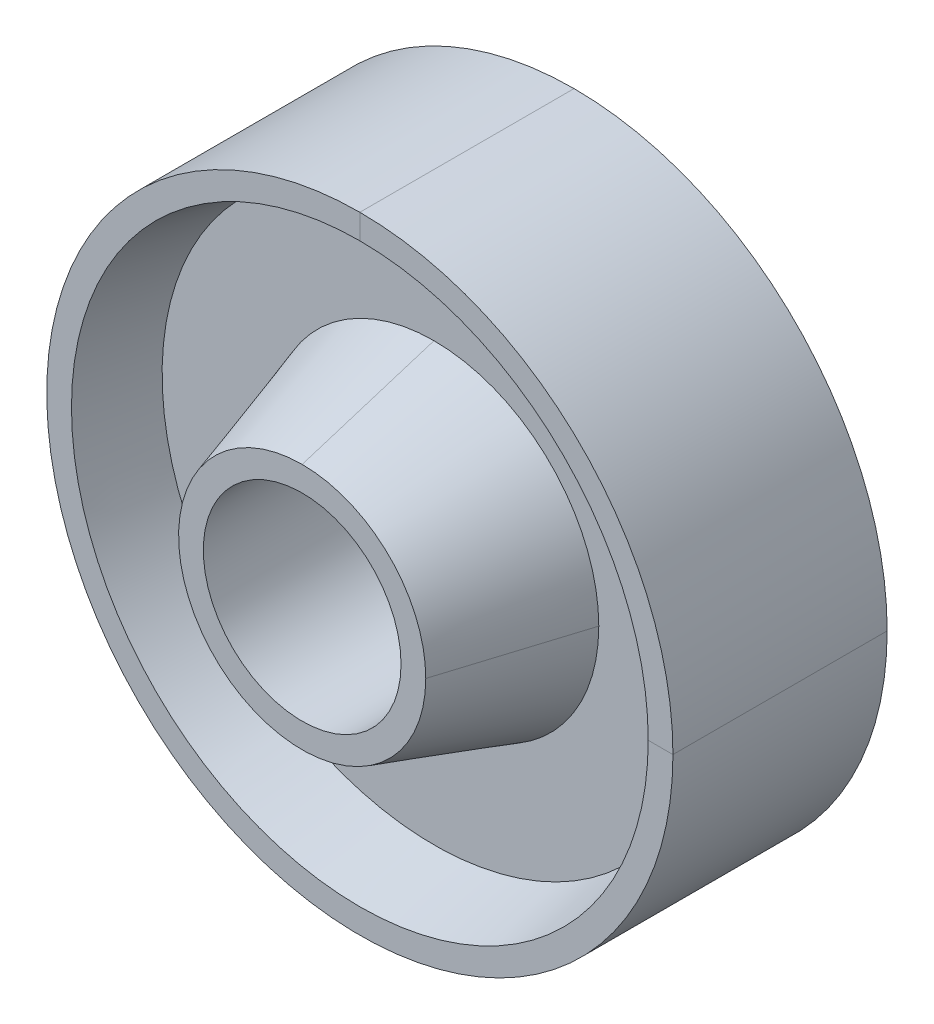
ISO-10303-21;
HEADER;
FILE_DESCRIPTION(('STEP AP214'),'2;1');
FILE_NAME('part.step','',(''),(''),'','','');
FILE_SCHEMA(('AUTOMOTIVE_DESIGN { 1 0 10303 214 1 1 1 1 }'));
ENDSEC;
DATA;
#1=APPLICATION_CONTEXT('core data for automotive mechanical design processes');
#2=APPLICATION_PROTOCOL_DEFINITION('international standard','automotive_design',2000,#1);
#3=PRODUCT_CONTEXT('',#1,'mechanical');
#4=PRODUCT('Part','Part','',(#3));
#5=PRODUCT_RELATED_PRODUCT_CATEGORY('part','',(#4));
#6=PRODUCT_DEFINITION_FORMATION('','',#4);
#7=PRODUCT_DEFINITION_CONTEXT('part definition',#1,'design');
#8=PRODUCT_DEFINITION('design','',#6,#7);
#9=PRODUCT_DEFINITION_SHAPE('','',#8);
#10=(LENGTH_UNIT() NAMED_UNIT(*) SI_UNIT(.MILLI.,.METRE.));
#11=(NAMED_UNIT(*) PLANE_ANGLE_UNIT() SI_UNIT($,.RADIAN.));
#12=(NAMED_UNIT(*) SI_UNIT($,.STERADIAN.) SOLID_ANGLE_UNIT());
#13=UNCERTAINTY_MEASURE_WITH_UNIT(LENGTH_MEASURE(1.E-05),#10,'distance_accuracy_value','');
#14=(GEOMETRIC_REPRESENTATION_CONTEXT(3) GLOBAL_UNCERTAINTY_ASSIGNED_CONTEXT((#13)) GLOBAL_UNIT_ASSIGNED_CONTEXT((#10,
#11,#12)) REPRESENTATION_CONTEXT('',''));
#15=CARTESIAN_POINT('',(0.,0.,0.));
#16=DIRECTION('',(0.,0.,1.));
#17=DIRECTION('',(1.,0.,0.));
#18=AXIS2_PLACEMENT_3D('',#15,#16,#17);
#19=CARTESIAN_POINT('',(0.,0.,20.));
#20=DIRECTION('',(0.,0.,1.));
#21=DIRECTION('',(1.,0.,0.));
#22=AXIS2_PLACEMENT_3D('',#19,#20,#21);
#23=PLANE('',#22);
#24=CARTESIAN_POINT('',(0.,0.,20.));
#25=DIRECTION('',(0.,0.,1.));
#26=DIRECTION('',(1.,0.,0.));
#27=AXIS2_PLACEMENT_3D('',#24,#25,#26);
#28=CIRCLE('',#27,15.);
#29=CARTESIAN_POINT('',(15.,0.,20.));
#30=VERTEX_POINT('',#29);
#31=CARTESIAN_POINT('',(0.,15.,20.));
#32=VERTEX_POINT('',#31);
#33=EDGE_CURVE('E11',#30,#32,#28,.T.);
#34=ORIENTED_EDGE('',*,*,#33,.T.);
#35=CARTESIAN_POINT('',(0.,0.,20.));
#36=DIRECTION('',(0.,0.,-1.));
#37=DIRECTION('',(1.,0.,0.));
#38=AXIS2_PLACEMENT_3D('',#35,#36,#37);
#39=CIRCLE('',#38,15.);
#40=EDGE_CURVE('E191',#30,#32,#39,.T.);
#41=ORIENTED_EDGE('',*,*,#40,.F.);
#42=EDGE_LOOP('',(#34,#41));
#43=FACE_BOUND('',#42,.T.);
#44=CARTESIAN_POINT('',(0.,0.,20.));
#45=DIRECTION('',(0.,0.,1.));
#46=DIRECTION('',(1.,0.,0.));
#47=AXIS2_PLACEMENT_3D('',#44,#45,#46);
#48=CIRCLE('',#47,12.);
#49=CARTESIAN_POINT('',(12.,0.,20.));
#50=VERTEX_POINT('',#49);
#51=EDGE_CURVE('E206',#50,#50,#48,.T.);
#52=ORIENTED_EDGE('',*,*,#51,.F.);
#53=EDGE_LOOP('',(#52));
#54=FACE_BOUND('',#53,.T.);
#55=ADVANCED_FACE('F45',(#43,#54),#23,.T.);
#56=CARTESIAN_POINT('',(0.,0.,-20.));
#57=DIRECTION('',(0.,0.,1.));
#58=DIRECTION('',(1.,0.,0.));
#59=AXIS2_PLACEMENT_3D('',#56,#57,#58);
#60=PLANE('',#59);
#61=CARTESIAN_POINT('',(0.,0.,-20.));
#62=DIRECTION('',(0.,0.,1.));
#63=DIRECTION('',(1.,0.,0.));
#64=AXIS2_PLACEMENT_3D('',#61,#62,#63);
#65=CIRCLE('',#64,15.);
#66=CARTESIAN_POINT('',(15.,0.,-20.));
#67=VERTEX_POINT('',#66);
#68=CARTESIAN_POINT('',(0.,15.,-20.));
#69=VERTEX_POINT('',#68);
#70=EDGE_CURVE('E55',#67,#69,#65,.T.);
#71=ORIENTED_EDGE('',*,*,#70,.F.);
#72=CARTESIAN_POINT('',(0.,0.,-20.));
#73=DIRECTION('',(0.,0.,-1.));
#74=DIRECTION('',(1.,0.,0.));
#75=AXIS2_PLACEMENT_3D('',#72,#73,#74);
#76=CIRCLE('',#75,15.);
#77=EDGE_CURVE('E195',#67,#69,#76,.T.);
#78=ORIENTED_EDGE('',*,*,#77,.T.);
#79=EDGE_LOOP('',(#71,#78));
#80=FACE_BOUND('',#79,.T.);
#81=CARTESIAN_POINT('',(0.,0.,-20.));
#82=DIRECTION('',(0.,0.,1.));
#83=DIRECTION('',(1.,0.,0.));
#84=AXIS2_PLACEMENT_3D('',#81,#82,#83);
#85=CIRCLE('',#84,12.);
#86=CARTESIAN_POINT('',(12.,0.,-20.));
#87=VERTEX_POINT('',#86);
#88=EDGE_CURVE('E205',#87,#87,#85,.T.);
#89=ORIENTED_EDGE('',*,*,#88,.T.);
#90=EDGE_LOOP('',(#89));
#91=FACE_BOUND('',#90,.T.);
#92=ADVANCED_FACE('F47',(#80,#91),#60,.F.);
#93=CARTESIAN_POINT('',(0.,0.,20.));
#94=DIRECTION('',(0.,0.,-1.));
#95=DIRECTION('',(-1.,0.,0.));
#96=AXIS2_PLACEMENT_3D('',#93,#94,#95);
#97=CYLINDRICAL_SURFACE('',#96,12.);
#98=ORIENTED_EDGE('',*,*,#51,.T.);
#99=EDGE_LOOP('',(#98));
#100=FACE_BOUND('',#99,.T.);
#101=ORIENTED_EDGE('',*,*,#88,.F.);
#102=EDGE_LOOP('',(#101));
#103=FACE_BOUND('',#102,.T.);
#104=ADVANCED_FACE('F310',(#100,#103),#97,.F.);
#105=CARTESIAN_POINT('',(0.,0.,-20.));
#106=DIRECTION('',(0.,0.,1.));
#107=DIRECTION('',(1.,0.,0.));
#108=AXIS2_PLACEMENT_3D('',#105,#106,#107);
#109=CONICAL_SURFACE('',#108,15.,0.302884868374971);
#110=DIRECTION('',(0.,0.298274993135947,0.95447997803503));
#111=VECTOR('',#110,1.);
#112=CARTESIAN_POINT('',(0.,20.,-4.));
#113=LINE('',#112,#111);
#114=CARTESIAN_POINT('',(0.,20.,-4.));
#115=VERTEX_POINT('',#114);
#116=EDGE_CURVE('E181',#69,#115,#113,.T.);
#117=ORIENTED_EDGE('',*,*,#116,.F.);
#118=ORIENTED_EDGE('',*,*,#77,.F.);
#119=DIRECTION('',(0.298274993135947,0.,0.95447997803503));
#120=VECTOR('',#119,1.);
#121=CARTESIAN_POINT('',(20.,0.,-4.));
#122=LINE('',#121,#120);
#123=CARTESIAN_POINT('',(20.,0.,-4.));
#124=VERTEX_POINT('',#123);
#125=EDGE_CURVE('E186',#67,#124,#122,.T.);
#126=ORIENTED_EDGE('',*,*,#125,.T.);
#127=CARTESIAN_POINT('',(0.,0.,-4.));
#128=DIRECTION('',(0.,0.,-1.));
#129=DIRECTION('',(1.,0.,0.));
#130=AXIS2_PLACEMENT_3D('',#127,#128,#129);
#131=CIRCLE('',#130,20.);
#132=EDGE_CURVE('E202',#124,#115,#131,.T.);
#133=ORIENTED_EDGE('',*,*,#132,.T.);
#134=EDGE_LOOP('',(#117,#118,#126,#133));
#135=FACE_BOUND('',#134,.T.);
#136=ADVANCED_FACE('F315',(#135),#109,.T.);
#137=CARTESIAN_POINT('',(0.,0.,-20.));
#138=DIRECTION('',(0.,0.,1.));
#139=DIRECTION('',(1.,0.,0.));
#140=AXIS2_PLACEMENT_3D('',#137,#138,#139);
#141=CONICAL_SURFACE('',#140,15.,0.302884868374971);
#142=CARTESIAN_POINT('',(0.,0.,-4.));
#143=DIRECTION('',(0.,0.,-1.));
#144=DIRECTION('',(0.,1.,0.));
#145=AXIS2_PLACEMENT_3D('',#142,#143,#144);
#146=CIRCLE('',#145,20.);
#147=EDGE_CURVE('E199',#115,#124,#146,.T.);
#148=ORIENTED_EDGE('',*,*,#147,.T.);
#149=ORIENTED_EDGE('',*,*,#125,.F.);
#150=ORIENTED_EDGE('',*,*,#70,.T.);
#151=ORIENTED_EDGE('',*,*,#116,.T.);
#152=EDGE_LOOP('',(#148,#149,#150,#151));
#153=FACE_BOUND('',#152,.T.);
#154=ADVANCED_FACE('F319',(#153),#141,.T.);
#155=CARTESIAN_POINT('',(0.,0.,4.));
#156=DIRECTION('',(0.,0.,-1.));
#157=DIRECTION('',(-1.,0.,0.));
#158=AXIS2_PLACEMENT_3D('',#155,#156,#157);
#159=CONICAL_SURFACE('',#158,20.,0.302884868374972);
#160=ORIENTED_EDGE('',*,*,#33,.F.);
#161=DIRECTION('',(-0.298274993135947,0.,0.95447997803503));
#162=VECTOR('',#161,1.);
#163=CARTESIAN_POINT('',(20.,0.,4.));
#164=LINE('',#163,#162);
#165=CARTESIAN_POINT('',(20.,0.,4.));
#166=VERTEX_POINT('',#165);
#167=EDGE_CURVE('E182',#166,#30,#164,.T.);
#168=ORIENTED_EDGE('',*,*,#167,.F.);
#169=CARTESIAN_POINT('',(0.,0.,4.));
#170=DIRECTION('',(0.,0.,-1.));
#171=DIRECTION('',(0.,1.,0.));
#172=AXIS2_PLACEMENT_3D('',#169,#170,#171);
#173=CIRCLE('',#172,20.);
#174=CARTESIAN_POINT('',(0.,20.,4.));
#175=VERTEX_POINT('',#174);
#176=EDGE_CURVE('E187',#175,#166,#173,.T.);
#177=ORIENTED_EDGE('',*,*,#176,.F.);
#178=DIRECTION('',(0.,-0.298274993135947,0.95447997803503));
#179=VECTOR('',#178,1.);
#180=CARTESIAN_POINT('',(0.,20.,4.));
#181=LINE('',#180,#179);
#182=EDGE_CURVE('E177',#175,#32,#181,.T.);
#183=ORIENTED_EDGE('',*,*,#182,.T.);
#184=EDGE_LOOP('',(#160,#168,#177,#183));
#185=FACE_BOUND('',#184,.T.);
#186=ADVANCED_FACE('F298',(#185),#159,.T.);
#187=CARTESIAN_POINT('',(0.,0.,4.));
#188=DIRECTION('',(0.,0.,-1.));
#189=DIRECTION('',(-1.,0.,0.));
#190=AXIS2_PLACEMENT_3D('',#187,#188,#189);
#191=CONICAL_SURFACE('',#190,20.,0.302884868374972);
#192=ORIENTED_EDGE('',*,*,#182,.F.);
#193=CARTESIAN_POINT('',(0.,0.,4.));
#194=DIRECTION('',(0.,0.,-1.));
#195=DIRECTION('',(1.,0.,0.));
#196=AXIS2_PLACEMENT_3D('',#193,#194,#195);
#197=CIRCLE('',#196,20.);
#198=EDGE_CURVE('E196',#166,#175,#197,.T.);
#199=ORIENTED_EDGE('',*,*,#198,.F.);
#200=ORIENTED_EDGE('',*,*,#167,.T.);
#201=ORIENTED_EDGE('',*,*,#40,.T.);
#202=EDGE_LOOP('',(#192,#199,#200,#201));
#203=FACE_BOUND('',#202,.T.);
#204=ADVANCED_FACE('F289',(#203),#191,.T.);
#205=CARTESIAN_POINT('',(20.,0.,4.));
#206=DIRECTION('',(0.,0.,1.));
#207=DIRECTION('',(1.,0.,0.));
#208=AXIS2_PLACEMENT_3D('',#205,#206,#207);
#209=PLANE('',#208);
#210=ORIENTED_EDGE('',*,*,#176,.T.);
#211=ORIENTED_EDGE('',*,*,#198,.T.);
#212=EDGE_LOOP('',(#210,#211));
#213=FACE_BOUND('',#212,.T.);
#214=CARTESIAN_POINT('',(0.,0.,4.));
#215=DIRECTION('',(0.,0.,-1.));
#216=DIRECTION('',(1.,0.,0.));
#217=AXIS2_PLACEMENT_3D('',#214,#215,#216);
#218=CIRCLE('',#217,33.);
#219=CARTESIAN_POINT('',(33.,0.,4.));
#220=VERTEX_POINT('',#219);
#221=CARTESIAN_POINT('',(0.,33.,4.));
#222=VERTEX_POINT('',#221);
#223=EDGE_CURVE('E174',#220,#222,#218,.T.);
#224=ORIENTED_EDGE('',*,*,#223,.F.);
#225=CARTESIAN_POINT('',(0.,0.,4.));
#226=DIRECTION('',(0.,0.,1.));
#227=DIRECTION('',(1.,0.,0.));
#228=AXIS2_PLACEMENT_3D('',#225,#226,#227);
#229=CIRCLE('',#228,33.);
#230=EDGE_CURVE('E62',#220,#222,#229,.T.);
#231=ORIENTED_EDGE('',*,*,#230,.T.);
#232=EDGE_LOOP('',(#224,#231));
#233=FACE_BOUND('',#232,.T.);
#234=ADVANCED_FACE('F286',(#213,#233),#209,.T.);
#235=CARTESIAN_POINT('',(20.,0.,-4.));
#236=DIRECTION('',(0.,0.,-1.));
#237=DIRECTION('',(-1.,0.,0.));
#238=AXIS2_PLACEMENT_3D('',#235,#236,#237);
#239=PLANE('',#238);
#240=CARTESIAN_POINT('',(0.,0.,-4.));
#241=DIRECTION('',(0.,0.,-1.));
#242=DIRECTION('',(1.,0.,0.));
#243=AXIS2_PLACEMENT_3D('',#240,#241,#242);
#244=CIRCLE('',#243,33.);
#245=CARTESIAN_POINT('',(33.,0.,-4.));
#246=VERTEX_POINT('',#245);
#247=CARTESIAN_POINT('',(0.,33.,-4.));
#248=VERTEX_POINT('',#247);
#249=EDGE_CURVE('E178',#246,#248,#244,.T.);
#250=ORIENTED_EDGE('',*,*,#249,.T.);
#251=CARTESIAN_POINT('',(0.,0.,-4.));
#252=DIRECTION('',(0.,0.,1.));
#253=DIRECTION('',(1.,0.,0.));
#254=AXIS2_PLACEMENT_3D('',#251,#252,#253);
#255=CIRCLE('',#254,33.);
#256=EDGE_CURVE('E70',#246,#248,#255,.T.);
#257=ORIENTED_EDGE('',*,*,#256,.F.);
#258=EDGE_LOOP('',(#250,#257));
#259=FACE_BOUND('',#258,.T.);
#260=ORIENTED_EDGE('',*,*,#132,.F.);
#261=ORIENTED_EDGE('',*,*,#147,.F.);
#262=EDGE_LOOP('',(#260,#261));
#263=FACE_BOUND('',#262,.T.);
#264=ADVANCED_FACE('F288',(#259,#263),#239,.T.);
#265=CARTESIAN_POINT('',(0.,0.,-4.));
#266=DIRECTION('',(0.,0.,1.));
#267=DIRECTION('',(1.,0.,0.));
#268=AXIS2_PLACEMENT_3D('',#265,#266,#267);
#269=CYLINDRICAL_SURFACE('',#268,38.);
#270=DIRECTION('',(0.,0.,1.));
#271=VECTOR('',#270,1.);
#272=CARTESIAN_POINT('',(38.,0.,13.));
#273=LINE('',#272,#271);
#274=CARTESIAN_POINT('',(38.,0.,-13.));
#275=VERTEX_POINT('',#274);
#276=CARTESIAN_POINT('',(38.,0.,13.));
#277=VERTEX_POINT('',#276);
#278=EDGE_CURVE('E154',#275,#277,#273,.T.);
#279=ORIENTED_EDGE('',*,*,#278,.F.);
#280=CARTESIAN_POINT('',(0.,0.,-13.));
#281=DIRECTION('',(0.,0.,1.));
#282=DIRECTION('',(1.,0.,0.));
#283=AXIS2_PLACEMENT_3D('',#280,#281,#282);
#284=CIRCLE('',#283,38.);
#285=CARTESIAN_POINT('',(0.,38.,-13.));
#286=VERTEX_POINT('',#285);
#287=EDGE_CURVE('E152',#275,#286,#284,.T.);
#288=ORIENTED_EDGE('',*,*,#287,.T.);
#289=DIRECTION('',(0.,0.,1.));
#290=VECTOR('',#289,1.);
#291=CARTESIAN_POINT('',(0.,38.,13.));
#292=LINE('',#291,#290);
#293=CARTESIAN_POINT('',(0.,38.,13.));
#294=VERTEX_POINT('',#293);
#295=EDGE_CURVE('E127',#286,#294,#292,.T.);
#296=ORIENTED_EDGE('',*,*,#295,.T.);
#297=CARTESIAN_POINT('',(0.,0.,13.));
#298=DIRECTION('',(0.,0.,1.));
#299=DIRECTION('',(1.,0.,0.));
#300=AXIS2_PLACEMENT_3D('',#297,#298,#299);
#301=CIRCLE('',#300,38.);
#302=EDGE_CURVE('E157',#277,#294,#301,.T.);
#303=ORIENTED_EDGE('',*,*,#302,.F.);
#304=EDGE_LOOP('',(#279,#288,#296,#303));
#305=FACE_BOUND('',#304,.T.);
#306=ADVANCED_FACE('F153',(#305),#269,.T.);
#307=CARTESIAN_POINT('',(0.,0.,-4.));
#308=DIRECTION('',(0.,0.,1.));
#309=DIRECTION('',(1.,0.,0.));
#310=AXIS2_PLACEMENT_3D('',#307,#308,#309);
#311=CYLINDRICAL_SURFACE('',#310,38.);
#312=CARTESIAN_POINT('',(0.,0.,13.));
#313=DIRECTION('',(0.,0.,1.));
#314=DIRECTION('',(0.,1.,0.));
#315=AXIS2_PLACEMENT_3D('',#312,#313,#314);
#316=CIRCLE('',#315,38.);
#317=EDGE_CURVE('E133',#294,#277,#316,.T.);
#318=ORIENTED_EDGE('',*,*,#317,.F.);
#319=ORIENTED_EDGE('',*,*,#295,.F.);
#320=CARTESIAN_POINT('',(0.,0.,-13.));
#321=DIRECTION('',(0.,0.,1.));
#322=DIRECTION('',(0.,1.,0.));
#323=AXIS2_PLACEMENT_3D('',#320,#321,#322);
#324=CIRCLE('',#323,38.);
#325=EDGE_CURVE('E130',#286,#275,#324,.T.);
#326=ORIENTED_EDGE('',*,*,#325,.T.);
#327=ORIENTED_EDGE('',*,*,#278,.T.);
#328=EDGE_LOOP('',(#318,#319,#326,#327));
#329=FACE_BOUND('',#328,.T.);
#330=ADVANCED_FACE('F129',(#329),#311,.T.);
#331=CARTESIAN_POINT('',(0.,38.,13.));
#332=DIRECTION('',(0.,0.,-1.));
#333=DIRECTION('',(-1.,0.,0.));
#334=AXIS2_PLACEMENT_3D('',#331,#332,#333);
#335=PLANE('',#334);
#336=CARTESIAN_POINT('',(0.,0.,13.));
#337=DIRECTION('',(0.,0.,1.));
#338=DIRECTION('',(0.,1.,0.));
#339=AXIS2_PLACEMENT_3D('',#336,#337,#338);
#340=CIRCLE('',#339,35.);
#341=CARTESIAN_POINT('',(0.,35.,13.));
#342=VERTEX_POINT('',#341);
#343=CARTESIAN_POINT('',(35.,0.,13.));
#344=VERTEX_POINT('',#343);
#345=EDGE_CURVE('E262',#342,#344,#340,.T.);
#346=ORIENTED_EDGE('',*,*,#345,.F.);
#347=DIRECTION('',(0.,-1.,0.));
#348=VECTOR('',#347,1.);
#349=CARTESIAN_POINT('',(0.,38.,13.));
#350=LINE('',#349,#348);
#351=EDGE_CURVE('E139',#294,#342,#350,.T.);
#352=ORIENTED_EDGE('',*,*,#351,.F.);
#353=ORIENTED_EDGE('',*,*,#317,.T.);
#354=DIRECTION('',(-1.,0.,0.));
#355=VECTOR('',#354,1.);
#356=CARTESIAN_POINT('',(38.,0.,13.));
#357=LINE('',#356,#355);
#358=EDGE_CURVE('E248',#277,#344,#357,.T.);
#359=ORIENTED_EDGE('',*,*,#358,.T.);
#360=EDGE_LOOP('',(#346,#352,#353,#359));
#361=FACE_BOUND('',#360,.T.);
#362=ADVANCED_FACE('F371',(#361),#335,.F.);
#363=CARTESIAN_POINT('',(0.,0.,13.));
#364=DIRECTION('',(0.,0.,1.));
#365=DIRECTION('',(1.,0.,0.));
#366=AXIS2_PLACEMENT_3D('',#363,#364,#365);
#367=CONICAL_SURFACE('',#366,35.,0.218668945873943);
#368=ORIENTED_EDGE('',*,*,#223,.T.);
#369=DIRECTION('',(0.,-0.216930457818657,-0.976187060183953));
#370=VECTOR('',#369,1.);
#371=CARTESIAN_POINT('',(0.,35.,13.));
#372=LINE('',#371,#370);
#373=EDGE_CURVE('E166',#342,#222,#372,.T.);
#374=ORIENTED_EDGE('',*,*,#373,.F.);
#375=ORIENTED_EDGE('',*,*,#345,.T.);
#376=DIRECTION('',(-0.216930457818657,0.,-0.976187060183953));
#377=VECTOR('',#376,1.);
#378=CARTESIAN_POINT('',(35.,0.,13.));
#379=LINE('',#378,#377);
#380=EDGE_CURVE('E244',#344,#220,#379,.T.);
#381=ORIENTED_EDGE('',*,*,#380,.T.);
#382=EDGE_LOOP('',(#368,#374,#375,#381));
#383=FACE_BOUND('',#382,.T.);
#384=ADVANCED_FACE('F285',(#383),#367,.F.);
#385=CARTESIAN_POINT('',(0.,0.,-4.));
#386=DIRECTION('',(0.,0.,-1.));
#387=DIRECTION('',(-1.,0.,0.));
#388=AXIS2_PLACEMENT_3D('',#385,#386,#387);
#389=CONICAL_SURFACE('',#388,33.,0.218668945873943);
#390=CARTESIAN_POINT('',(0.,0.,-13.));
#391=DIRECTION('',(0.,0.,1.));
#392=DIRECTION('',(0.,1.,0.));
#393=AXIS2_PLACEMENT_3D('',#390,#391,#392);
#394=CIRCLE('',#393,35.);
#395=CARTESIAN_POINT('',(0.,35.,-13.));
#396=VERTEX_POINT('',#395);
#397=CARTESIAN_POINT('',(35.,0.,-13.));
#398=VERTEX_POINT('',#397);
#399=EDGE_CURVE('E260',#396,#398,#394,.T.);
#400=ORIENTED_EDGE('',*,*,#399,.F.);
#401=DIRECTION('',(0.,0.216930457818657,-0.976187060183953));
#402=VECTOR('',#401,1.);
#403=CARTESIAN_POINT('',(0.,35.,-13.));
#404=LINE('',#403,#402);
#405=EDGE_CURVE('E163',#248,#396,#404,.T.);
#406=ORIENTED_EDGE('',*,*,#405,.F.);
#407=ORIENTED_EDGE('',*,*,#249,.F.);
#408=DIRECTION('',(0.216930457818657,0.,-0.976187060183953));
#409=VECTOR('',#408,1.);
#410=CARTESIAN_POINT('',(35.,0.,-13.));
#411=LINE('',#410,#409);
#412=EDGE_CURVE('E173',#246,#398,#411,.T.);
#413=ORIENTED_EDGE('',*,*,#412,.T.);
#414=EDGE_LOOP('',(#400,#406,#407,#413));
#415=FACE_BOUND('',#414,.T.);
#416=ADVANCED_FACE('F389',(#415),#389,.F.);
#417=CARTESIAN_POINT('',(0.,38.,-13.));
#418=DIRECTION('',(0.,0.,1.));
#419=DIRECTION('',(1.,0.,0.));
#420=AXIS2_PLACEMENT_3D('',#417,#418,#419);
#421=PLANE('',#420);
#422=DIRECTION('',(1.,0.,0.));
#423=VECTOR('',#422,1.);
#424=CARTESIAN_POINT('',(38.,0.,-13.));
#425=LINE('',#424,#423);
#426=EDGE_CURVE('E148',#398,#275,#425,.T.);
#427=ORIENTED_EDGE('',*,*,#426,.T.);
#428=ORIENTED_EDGE('',*,*,#325,.F.);
#429=DIRECTION('',(0.,1.,0.));
#430=VECTOR('',#429,1.);
#431=CARTESIAN_POINT('',(0.,38.,-13.));
#432=LINE('',#431,#430);
#433=EDGE_CURVE('E145',#396,#286,#432,.T.);
#434=ORIENTED_EDGE('',*,*,#433,.F.);
#435=ORIENTED_EDGE('',*,*,#399,.T.);
#436=EDGE_LOOP('',(#427,#428,#434,#435));
#437=FACE_BOUND('',#436,.T.);
#438=ADVANCED_FACE('F143',(#437),#421,.F.);
#439=CARTESIAN_POINT('',(38.,0.,13.));
#440=DIRECTION('',(0.,0.,-1.));
#441=DIRECTION('',(-1.,0.,0.));
#442=AXIS2_PLACEMENT_3D('',#439,#440,#441);
#443=PLANE('',#442);
#444=ORIENTED_EDGE('',*,*,#302,.T.);
#445=ORIENTED_EDGE('',*,*,#351,.T.);
#446=CARTESIAN_POINT('',(0.,0.,13.));
#447=DIRECTION('',(0.,0.,1.));
#448=DIRECTION('',(1.,0.,0.));
#449=AXIS2_PLACEMENT_3D('',#446,#447,#448);
#450=CIRCLE('',#449,35.);
#451=EDGE_CURVE('E259',#344,#342,#450,.T.);
#452=ORIENTED_EDGE('',*,*,#451,.F.);
#453=ORIENTED_EDGE('',*,*,#358,.F.);
#454=EDGE_LOOP('',(#444,#445,#452,#453));
#455=FACE_BOUND('',#454,.T.);
#456=ADVANCED_FACE('F406',(#455),#443,.F.);
#457=CARTESIAN_POINT('',(0.,0.,13.));
#458=DIRECTION('',(0.,0.,1.));
#459=DIRECTION('',(1.,0.,0.));
#460=AXIS2_PLACEMENT_3D('',#457,#458,#459);
#461=CONICAL_SURFACE('',#460,35.,0.218668945873943);
#462=ORIENTED_EDGE('',*,*,#451,.T.);
#463=ORIENTED_EDGE('',*,*,#373,.T.);
#464=ORIENTED_EDGE('',*,*,#230,.F.);
#465=ORIENTED_EDGE('',*,*,#380,.F.);
#466=EDGE_LOOP('',(#462,#463,#464,#465));
#467=FACE_BOUND('',#466,.T.);
#468=ADVANCED_FACE('F284',(#467),#461,.F.);
#469=CARTESIAN_POINT('',(0.,0.,-4.));
#470=DIRECTION('',(0.,0.,-1.));
#471=DIRECTION('',(-1.,0.,0.));
#472=AXIS2_PLACEMENT_3D('',#469,#470,#471);
#473=CONICAL_SURFACE('',#472,33.,0.218668945873943);
#474=ORIENTED_EDGE('',*,*,#256,.T.);
#475=ORIENTED_EDGE('',*,*,#405,.T.);
#476=CARTESIAN_POINT('',(0.,0.,-13.));
#477=DIRECTION('',(0.,0.,1.));
#478=DIRECTION('',(1.,0.,0.));
#479=AXIS2_PLACEMENT_3D('',#476,#477,#478);
#480=CIRCLE('',#479,35.);
#481=EDGE_CURVE('E161',#398,#396,#480,.T.);
#482=ORIENTED_EDGE('',*,*,#481,.F.);
#483=ORIENTED_EDGE('',*,*,#412,.F.);
#484=EDGE_LOOP('',(#474,#475,#482,#483));
#485=FACE_BOUND('',#484,.T.);
#486=ADVANCED_FACE('F423',(#485),#473,.F.);
#487=CARTESIAN_POINT('',(38.,0.,-13.));
#488=DIRECTION('',(0.,0.,1.));
#489=DIRECTION('',(1.,0.,0.));
#490=AXIS2_PLACEMENT_3D('',#487,#488,#489);
#491=PLANE('',#490);
#492=ORIENTED_EDGE('',*,*,#481,.T.);
#493=ORIENTED_EDGE('',*,*,#433,.T.);
#494=ORIENTED_EDGE('',*,*,#287,.F.);
#495=ORIENTED_EDGE('',*,*,#426,.F.);
#496=EDGE_LOOP('',(#492,#493,#494,#495));
#497=FACE_BOUND('',#496,.T.);
#498=ADVANCED_FACE('F159',(#497),#491,.F.);
#499=CLOSED_SHELL('',(#55,#92,#104,#136,#154,#186,#204,#234,#264,#306,#330,#362,#384,#416,#438,
#456,#468,#486,#498));
#500=MANIFOLD_SOLID_BREP('B2',#499);
#501=ADVANCED_BREP_SHAPE_REPRESENTATION('',(#18,#500),#14);
#502=SHAPE_DEFINITION_REPRESENTATION(#9,#501);
ENDSEC;
END-ISO-10303-21;
